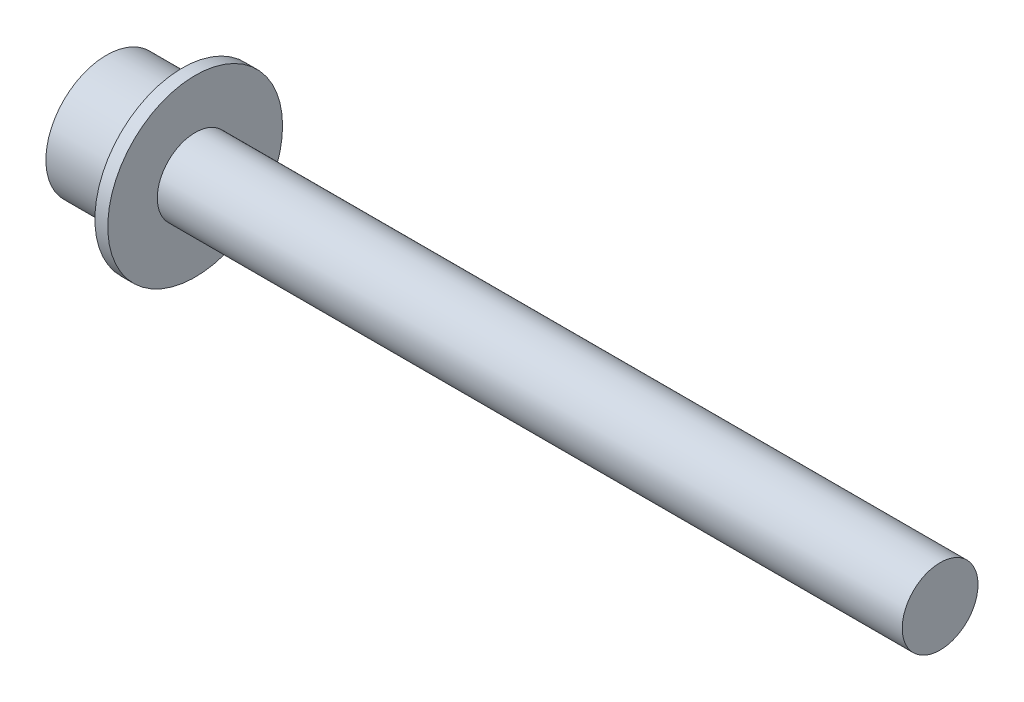
ISO-10303-21;
HEADER;
FILE_DESCRIPTION(('STEP AP214'),'2;1');
FILE_NAME('part.step','',(''),(''),'','','');
FILE_SCHEMA(('AUTOMOTIVE_DESIGN { 1 0 10303 214 1 1 1 1 }'));
ENDSEC;
DATA;
#1=APPLICATION_CONTEXT('core data for automotive mechanical design processes');
#2=APPLICATION_PROTOCOL_DEFINITION('international standard','automotive_design',2000,#1);
#3=PRODUCT_CONTEXT('',#1,'mechanical');
#4=PRODUCT('Part','Part','',(#3));
#5=PRODUCT_RELATED_PRODUCT_CATEGORY('part','',(#4));
#6=PRODUCT_DEFINITION_FORMATION('','',#4);
#7=PRODUCT_DEFINITION_CONTEXT('part definition',#1,'design');
#8=PRODUCT_DEFINITION('design','',#6,#7);
#9=PRODUCT_DEFINITION_SHAPE('','',#8);
#10=(LENGTH_UNIT() NAMED_UNIT(*) SI_UNIT(.MILLI.,.METRE.));
#11=(NAMED_UNIT(*) PLANE_ANGLE_UNIT() SI_UNIT($,.RADIAN.));
#12=(NAMED_UNIT(*) SI_UNIT($,.STERADIAN.) SOLID_ANGLE_UNIT());
#13=UNCERTAINTY_MEASURE_WITH_UNIT(LENGTH_MEASURE(1.E-05),#10,'distance_accuracy_value','');
#14=(GEOMETRIC_REPRESENTATION_CONTEXT(3) GLOBAL_UNCERTAINTY_ASSIGNED_CONTEXT((#13)) GLOBAL_UNIT_ASSIGNED_CONTEXT((#10,
#11,#12)) REPRESENTATION_CONTEXT('',''));
#15=CARTESIAN_POINT('',(0.,0.,0.));
#16=DIRECTION('',(0.,0.,1.));
#17=DIRECTION('',(1.,0.,0.));
#18=AXIS2_PLACEMENT_3D('',#15,#16,#17);
#19=CARTESIAN_POINT('',(3.,0.,0.));
#20=DIRECTION('',(-1.,0.,0.));
#21=DIRECTION('',(0.,0.,1.));
#22=AXIS2_PLACEMENT_3D('',#19,#20,#21);
#23=CYLINDRICAL_SURFACE('',#22,2.4);
#24=CARTESIAN_POINT('',(3.,0.,0.));
#25=DIRECTION('',(1.,0.,0.));
#26=DIRECTION('',(0.,0.,-1.));
#27=AXIS2_PLACEMENT_3D('',#24,#25,#26);
#28=CIRCLE('',#27,2.4);
#29=CARTESIAN_POINT('',(3.,0.,-2.4));
#30=VERTEX_POINT('',#29);
#31=EDGE_CURVE('E10',#30,#30,#28,.T.);
#32=ORIENTED_EDGE('',*,*,#31,.F.);
#33=EDGE_LOOP('',(#32));
#34=FACE_BOUND('',#33,.T.);
#35=CARTESIAN_POINT('',(0.,0.,0.));
#36=DIRECTION('',(1.,0.,0.));
#37=DIRECTION('',(0.,0.,-1.));
#38=AXIS2_PLACEMENT_3D('',#35,#36,#37);
#39=CIRCLE('',#38,2.4);
#40=CARTESIAN_POINT('',(0.,0.,-2.4));
#41=VERTEX_POINT('',#40);
#42=EDGE_CURVE('E49',#41,#41,#39,.T.);
#43=ORIENTED_EDGE('',*,*,#42,.T.);
#44=EDGE_LOOP('',(#43));
#45=FACE_BOUND('',#44,.T.);
#46=ADVANCED_FACE('F41',(#34,#45),#23,.T.);
#47=CARTESIAN_POINT('',(0.,0.,0.));
#48=DIRECTION('',(1.,0.,0.));
#49=DIRECTION('',(0.,0.,-1.));
#50=AXIS2_PLACEMENT_3D('',#47,#48,#49);
#51=PLANE('',#50);
#52=ORIENTED_EDGE('',*,*,#42,.F.);
#53=EDGE_LOOP('',(#52));
#54=FACE_BOUND('',#53,.T.);
#55=ADVANCED_FACE('F86',(#54),#51,.F.);
#56=CARTESIAN_POINT('',(3.51,0.,0.));
#57=DIRECTION('',(-1.,0.,0.));
#58=DIRECTION('',(0.,0.,1.));
#59=AXIS2_PLACEMENT_3D('',#56,#57,#58);
#60=CYLINDRICAL_SURFACE('',#59,3.46);
#61=CARTESIAN_POINT('',(3.51,0.,0.));
#62=DIRECTION('',(1.,0.,0.));
#63=DIRECTION('',(0.,0.,-1.));
#64=AXIS2_PLACEMENT_3D('',#61,#62,#63);
#65=CIRCLE('',#64,3.46);
#66=CARTESIAN_POINT('',(3.51,0.,-3.46));
#67=VERTEX_POINT('',#66);
#68=EDGE_CURVE('E66',#67,#67,#65,.T.);
#69=ORIENTED_EDGE('',*,*,#68,.F.);
#70=EDGE_LOOP('',(#69));
#71=FACE_BOUND('',#70,.T.);
#72=CARTESIAN_POINT('',(3.,0.,0.));
#73=DIRECTION('',(1.,0.,0.));
#74=DIRECTION('',(0.,0.,-1.));
#75=AXIS2_PLACEMENT_3D('',#72,#73,#74);
#76=CIRCLE('',#75,3.46);
#77=CARTESIAN_POINT('',(3.,0.,-3.46));
#78=VERTEX_POINT('',#77);
#79=EDGE_CURVE('E62',#78,#78,#76,.T.);
#80=ORIENTED_EDGE('',*,*,#79,.T.);
#81=EDGE_LOOP('',(#80));
#82=FACE_BOUND('',#81,.T.);
#83=ADVANCED_FACE('F79',(#71,#82),#60,.T.);
#84=CARTESIAN_POINT('',(3.51,0.,0.));
#85=DIRECTION('',(1.,0.,0.));
#86=DIRECTION('',(0.,0.,-1.));
#87=AXIS2_PLACEMENT_3D('',#84,#85,#86);
#88=PLANE('',#87);
#89=CARTESIAN_POINT('',(3.51,0.,0.));
#90=DIRECTION('',(1.,0.,0.));
#91=DIRECTION('',(0.,0.,-1.));
#92=AXIS2_PLACEMENT_3D('',#89,#90,#91);
#93=CIRCLE('',#92,1.5);
#94=CARTESIAN_POINT('',(3.51,0.,-1.5));
#95=VERTEX_POINT('',#94);
#96=EDGE_CURVE('E44',#95,#95,#93,.T.);
#97=ORIENTED_EDGE('',*,*,#96,.F.);
#98=EDGE_LOOP('',(#97));
#99=FACE_BOUND('',#98,.T.);
#100=ORIENTED_EDGE('',*,*,#68,.T.);
#101=EDGE_LOOP('',(#100));
#102=FACE_BOUND('',#101,.T.);
#103=ADVANCED_FACE('F76',(#99,#102),#88,.T.);
#104=CARTESIAN_POINT('',(3.,0.,0.));
#105=DIRECTION('',(1.,0.,0.));
#106=DIRECTION('',(0.,0.,-1.));
#107=AXIS2_PLACEMENT_3D('',#104,#105,#106);
#108=PLANE('',#107);
#109=ORIENTED_EDGE('',*,*,#31,.T.);
#110=EDGE_LOOP('',(#109));
#111=FACE_BOUND('',#110,.T.);
#112=ORIENTED_EDGE('',*,*,#79,.F.);
#113=EDGE_LOOP('',(#112));
#114=FACE_BOUND('',#113,.T.);
#115=ADVANCED_FACE('F78',(#111,#114),#108,.F.);
#116=CARTESIAN_POINT('',(33.,0.,0.));
#117=DIRECTION('',(1.,0.,0.));
#118=DIRECTION('',(0.,0.,-1.));
#119=AXIS2_PLACEMENT_3D('',#116,#117,#118);
#120=PLANE('',#119);
#121=CARTESIAN_POINT('',(33.,0.,0.));
#122=DIRECTION('',(1.,0.,0.));
#123=DIRECTION('',(0.,0.,-1.));
#124=AXIS2_PLACEMENT_3D('',#121,#122,#123);
#125=CIRCLE('',#124,1.5);
#126=CARTESIAN_POINT('',(33.,0.,-1.5));
#127=VERTEX_POINT('',#126);
#128=EDGE_CURVE('E57',#127,#127,#125,.T.);
#129=ORIENTED_EDGE('',*,*,#128,.T.);
#130=EDGE_LOOP('',(#129));
#131=FACE_BOUND('',#130,.T.);
#132=ADVANCED_FACE('F84',(#131),#120,.T.);
#133=CARTESIAN_POINT('',(33.,0.,0.));
#134=DIRECTION('',(-1.,0.,0.));
#135=DIRECTION('',(0.,0.,1.));
#136=AXIS2_PLACEMENT_3D('',#133,#134,#135);
#137=CYLINDRICAL_SURFACE('',#136,1.5);
#138=ORIENTED_EDGE('',*,*,#96,.T.);
#139=EDGE_LOOP('',(#138));
#140=FACE_BOUND('',#139,.T.);
#141=ORIENTED_EDGE('',*,*,#128,.F.);
#142=EDGE_LOOP('',(#141));
#143=FACE_BOUND('',#142,.T.);
#144=ADVANCED_FACE('F73',(#140,#143),#137,.T.);
#145=CLOSED_SHELL('',(#46,#55,#83,#103,#115,#132,#144));
#146=MANIFOLD_SOLID_BREP('B2',#145);
#147=ADVANCED_BREP_SHAPE_REPRESENTATION('',(#18,#146),#14);
#148=SHAPE_DEFINITION_REPRESENTATION(#9,#147);
ENDSEC;
END-ISO-10303-21;
